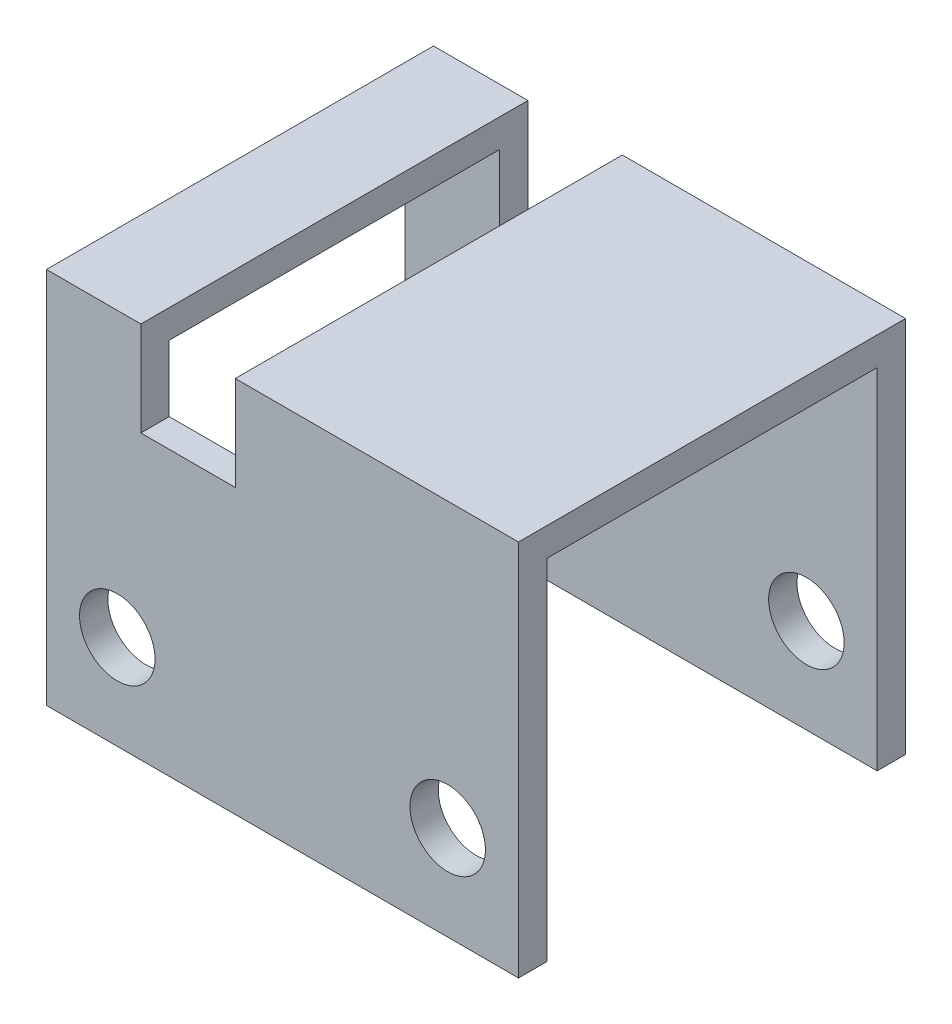
ISO-10303-21;
HEADER;
FILE_DESCRIPTION(('STEP AP214'),'2;1');
FILE_NAME('part.step','',(''),(''),'','','');
FILE_SCHEMA(('AUTOMOTIVE_DESIGN { 1 0 10303 214 1 1 1 1 }'));
ENDSEC;
DATA;
#1=APPLICATION_CONTEXT('core data for automotive mechanical design processes');
#2=APPLICATION_PROTOCOL_DEFINITION('international standard','automotive_design',2000,#1);
#3=PRODUCT_CONTEXT('',#1,'mechanical');
#4=PRODUCT('Part','Part','',(#3));
#5=PRODUCT_RELATED_PRODUCT_CATEGORY('part','',(#4));
#6=PRODUCT_DEFINITION_FORMATION('','',#4);
#7=PRODUCT_DEFINITION_CONTEXT('part definition',#1,'design');
#8=PRODUCT_DEFINITION('design','',#6,#7);
#9=PRODUCT_DEFINITION_SHAPE('','',#8);
#10=(LENGTH_UNIT() NAMED_UNIT(*) SI_UNIT(.MILLI.,.METRE.));
#11=(NAMED_UNIT(*) PLANE_ANGLE_UNIT() SI_UNIT($,.RADIAN.));
#12=(NAMED_UNIT(*) SI_UNIT($,.STERADIAN.) SOLID_ANGLE_UNIT());
#13=UNCERTAINTY_MEASURE_WITH_UNIT(LENGTH_MEASURE(1.E-05),#10,'distance_accuracy_value','');
#14=(GEOMETRIC_REPRESENTATION_CONTEXT(3) GLOBAL_UNCERTAINTY_ASSIGNED_CONTEXT((#13)) GLOBAL_UNIT_ASSIGNED_CONTEXT((#10,
#11,#12)) REPRESENTATION_CONTEXT('',''));
#15=CARTESIAN_POINT('',(0.,0.,0.));
#16=DIRECTION('',(0.,0.,1.));
#17=DIRECTION('',(1.,0.,0.));
#18=AXIS2_PLACEMENT_3D('',#15,#16,#17);
#19=CARTESIAN_POINT('',(-25.,-37.,41.));
#20=DIRECTION('',(0.,1.,0.));
#21=DIRECTION('',(0.,0.,1.));
#22=AXIS2_PLACEMENT_3D('',#19,#20,#21);
#23=PLANE('',#22);
#24=DIRECTION('',(0.,0.,-1.));
#25=VECTOR('',#24,1.);
#26=CARTESIAN_POINT('',(-25.,-37.,41.));
#27=LINE('',#26,#25);
#28=CARTESIAN_POINT('',(-25.,-37.,41.));
#29=VERTEX_POINT('',#28);
#30=CARTESIAN_POINT('',(-25.,-37.,38.));
#31=VERTEX_POINT('',#30);
#32=EDGE_CURVE('E165',#29,#31,#27,.T.);
#33=ORIENTED_EDGE('',*,*,#32,.T.);
#34=DIRECTION('',(1.,0.,0.));
#35=VECTOR('',#34,1.);
#36=CARTESIAN_POINT('',(-25.,-37.,38.));
#37=LINE('',#36,#35);
#38=CARTESIAN_POINT('',(25.,-37.,38.));
#39=VERTEX_POINT('',#38);
#40=EDGE_CURVE('E148',#31,#39,#37,.T.);
#41=ORIENTED_EDGE('',*,*,#40,.T.);
#42=DIRECTION('',(0.,0.,-1.));
#43=VECTOR('',#42,1.);
#44=CARTESIAN_POINT('',(25.,-37.,41.));
#45=LINE('',#44,#43);
#46=CARTESIAN_POINT('',(25.,-37.,41.));
#47=VERTEX_POINT('',#46);
#48=EDGE_CURVE('E177',#47,#39,#45,.T.);
#49=ORIENTED_EDGE('',*,*,#48,.F.);
#50=DIRECTION('',(1.,0.,0.));
#51=VECTOR('',#50,1.);
#52=CARTESIAN_POINT('',(-25.,-37.,41.));
#53=LINE('',#52,#51);
#54=EDGE_CURVE('E171',#29,#47,#53,.T.);
#55=ORIENTED_EDGE('',*,*,#54,.F.);
#56=EDGE_LOOP('',(#33,#41,#49,#55));
#57=FACE_BOUND('',#56,.T.);
#58=ADVANCED_FACE('F33',(#57),#23,.F.);
#59=CARTESIAN_POINT('',(-15.,-7.,41.));
#60=DIRECTION('',(0.,-1.,0.));
#61=DIRECTION('',(0.,0.,-1.));
#62=AXIS2_PLACEMENT_3D('',#59,#60,#61);
#63=PLANE('',#62);
#64=DIRECTION('',(0.,0.,-1.));
#65=VECTOR('',#64,1.);
#66=CARTESIAN_POINT('',(-5.,-7.,41.));
#67=LINE('',#66,#65);
#68=CARTESIAN_POINT('',(-5.,-7.,41.));
#69=VERTEX_POINT('',#68);
#70=CARTESIAN_POINT('',(-5.,-7.,38.));
#71=VERTEX_POINT('',#70);
#72=EDGE_CURVE('E281',#69,#71,#67,.T.);
#73=ORIENTED_EDGE('',*,*,#72,.T.);
#74=DIRECTION('',(-1.,0.,0.));
#75=VECTOR('',#74,1.);
#76=CARTESIAN_POINT('',(-15.,-7.,38.));
#77=LINE('',#76,#75);
#78=CARTESIAN_POINT('',(-15.,-7.,38.));
#79=VERTEX_POINT('',#78);
#80=EDGE_CURVE('E229',#71,#79,#77,.T.);
#81=ORIENTED_EDGE('',*,*,#80,.T.);
#82=DIRECTION('',(0.,0.,-1.));
#83=VECTOR('',#82,1.);
#84=CARTESIAN_POINT('',(-15.,-7.,41.));
#85=LINE('',#84,#83);
#86=CARTESIAN_POINT('',(-15.,-7.,41.));
#87=VERTEX_POINT('',#86);
#88=EDGE_CURVE('E277',#87,#79,#85,.T.);
#89=ORIENTED_EDGE('',*,*,#88,.F.);
#90=DIRECTION('',(-1.,0.,0.));
#91=VECTOR('',#90,1.);
#92=CARTESIAN_POINT('',(-15.,-7.,41.));
#93=LINE('',#92,#91);
#94=EDGE_CURVE('E246',#69,#87,#93,.T.);
#95=ORIENTED_EDGE('',*,*,#94,.F.);
#96=EDGE_LOOP('',(#73,#81,#89,#95));
#97=FACE_BOUND('',#96,.T.);
#98=ADVANCED_FACE('F324',(#97),#63,.F.);
#99=CARTESIAN_POINT('',(-25.,-37.,41.));
#100=DIRECTION('',(1.,0.,0.));
#101=DIRECTION('',(0.,1.,0.));
#102=AXIS2_PLACEMENT_3D('',#99,#100,#101);
#103=PLANE('',#102);
#104=DIRECTION('',(0.,0.,1.));
#105=VECTOR('',#104,1.);
#106=CARTESIAN_POINT('',(-25.,0.,38.));
#107=LINE('',#106,#105);
#108=CARTESIAN_POINT('',(-25.,0.,3.));
#109=VERTEX_POINT('',#108);
#110=CARTESIAN_POINT('',(-25.,0.,38.));
#111=VERTEX_POINT('',#110);
#112=EDGE_CURVE('E160',#109,#111,#107,.T.);
#113=ORIENTED_EDGE('',*,*,#112,.T.);
#114=DIRECTION('',(0.,-1.,0.));
#115=VECTOR('',#114,1.);
#116=CARTESIAN_POINT('',(-25.,-37.,38.));
#117=LINE('',#116,#115);
#118=EDGE_CURVE('E152',#111,#31,#117,.T.);
#119=ORIENTED_EDGE('',*,*,#118,.T.);
#120=ORIENTED_EDGE('',*,*,#32,.F.);
#121=DIRECTION('',(0.,-1.,0.));
#122=VECTOR('',#121,1.);
#123=CARTESIAN_POINT('',(-25.,-37.,41.));
#124=LINE('',#123,#122);
#125=CARTESIAN_POINT('',(-25.,3.,41.));
#126=VERTEX_POINT('',#125);
#127=EDGE_CURVE('E236',#126,#29,#124,.T.);
#128=ORIENTED_EDGE('',*,*,#127,.F.);
#129=DIRECTION('',(0.,0.,-1.));
#130=VECTOR('',#129,1.);
#131=CARTESIAN_POINT('',(-25.,3.,41.));
#132=LINE('',#131,#130);
#133=CARTESIAN_POINT('',(-25.,3.,0.));
#134=VERTEX_POINT('',#133);
#135=EDGE_CURVE('E252',#126,#134,#132,.T.);
#136=ORIENTED_EDGE('',*,*,#135,.T.);
#137=DIRECTION('',(0.,-1.,0.));
#138=VECTOR('',#137,1.);
#139=CARTESIAN_POINT('',(-25.,-37.,0.));
#140=LINE('',#139,#138);
#141=CARTESIAN_POINT('',(-25.,-37.,0.));
#142=VERTEX_POINT('',#141);
#143=EDGE_CURVE('E235',#134,#142,#140,.T.);
#144=ORIENTED_EDGE('',*,*,#143,.T.);
#145=CARTESIAN_POINT('',(-25.,-37.,3.));
#146=VERTEX_POINT('',#145);
#147=EDGE_CURVE('E174',#146,#142,#27,.T.);
#148=ORIENTED_EDGE('',*,*,#147,.F.);
#149=DIRECTION('',(0.,1.,0.));
#150=VECTOR('',#149,1.);
#151=CARTESIAN_POINT('',(-25.,-37.,3.));
#152=LINE('',#151,#150);
#153=EDGE_CURVE('E168',#146,#109,#152,.T.);
#154=ORIENTED_EDGE('',*,*,#153,.T.);
#155=EDGE_LOOP('',(#113,#119,#120,#128,#136,#144,#148,#154));
#156=FACE_BOUND('',#155,.T.);
#157=ADVANCED_FACE('F35',(#156),#103,.F.);
#158=CARTESIAN_POINT('',(25.,-37.,3.));
#159=VERTEX_POINT('',#158);
#160=CARTESIAN_POINT('',(25.,-37.,0.));
#161=VERTEX_POINT('',#160);
#162=EDGE_CURVE('E288',#159,#161,#45,.T.);
#163=ORIENTED_EDGE('',*,*,#162,.F.);
#164=DIRECTION('',(1.,0.,0.));
#165=VECTOR('',#164,1.);
#166=CARTESIAN_POINT('',(-25.,-37.,3.));
#167=LINE('',#166,#165);
#168=EDGE_CURVE('E50',#146,#159,#167,.T.);
#169=ORIENTED_EDGE('',*,*,#168,.F.);
#170=ORIENTED_EDGE('',*,*,#147,.T.);
#171=DIRECTION('',(1.,0.,0.));
#172=VECTOR('',#171,1.);
#173=CARTESIAN_POINT('',(-25.,-37.,0.));
#174=LINE('',#173,#172);
#175=EDGE_CURVE('E255',#142,#161,#174,.T.);
#176=ORIENTED_EDGE('',*,*,#175,.T.);
#177=EDGE_LOOP('',(#163,#169,#170,#176));
#178=FACE_BOUND('',#177,.T.);
#179=ADVANCED_FACE('F313',(#178),#23,.F.);
#180=CARTESIAN_POINT('',(25.,-37.,41.));
#181=DIRECTION('',(-1.,0.,0.));
#182=DIRECTION('',(0.,0.,1.));
#183=AXIS2_PLACEMENT_3D('',#180,#181,#182);
#184=PLANE('',#183);
#185=ORIENTED_EDGE('',*,*,#48,.T.);
#186=DIRECTION('',(0.,-1.,0.));
#187=VECTOR('',#186,1.);
#188=CARTESIAN_POINT('',(25.,-37.,38.));
#189=LINE('',#188,#187);
#190=CARTESIAN_POINT('',(25.,0.,38.));
#191=VERTEX_POINT('',#190);
#192=EDGE_CURVE('E155',#191,#39,#189,.T.);
#193=ORIENTED_EDGE('',*,*,#192,.F.);
#194=DIRECTION('',(0.,0.,1.));
#195=VECTOR('',#194,1.);
#196=CARTESIAN_POINT('',(25.,0.,38.));
#197=LINE('',#196,#195);
#198=CARTESIAN_POINT('',(25.,0.,3.));
#199=VERTEX_POINT('',#198);
#200=EDGE_CURVE('E169',#199,#191,#197,.T.);
#201=ORIENTED_EDGE('',*,*,#200,.F.);
#202=DIRECTION('',(0.,1.,0.));
#203=VECTOR('',#202,1.);
#204=CARTESIAN_POINT('',(25.,-37.,3.));
#205=LINE('',#204,#203);
#206=EDGE_CURVE('E210',#159,#199,#205,.T.);
#207=ORIENTED_EDGE('',*,*,#206,.F.);
#208=ORIENTED_EDGE('',*,*,#162,.T.);
#209=DIRECTION('',(0.,1.,0.));
#210=VECTOR('',#209,1.);
#211=CARTESIAN_POINT('',(25.,-37.,0.));
#212=LINE('',#211,#210);
#213=CARTESIAN_POINT('',(25.,3.,0.));
#214=VERTEX_POINT('',#213);
#215=EDGE_CURVE('E258',#161,#214,#212,.T.);
#216=ORIENTED_EDGE('',*,*,#215,.T.);
#217=DIRECTION('',(0.,0.,-1.));
#218=VECTOR('',#217,1.);
#219=CARTESIAN_POINT('',(25.,3.,41.));
#220=LINE('',#219,#218);
#221=CARTESIAN_POINT('',(25.,3.,41.));
#222=VERTEX_POINT('',#221);
#223=EDGE_CURVE('E286',#222,#214,#220,.T.);
#224=ORIENTED_EDGE('',*,*,#223,.F.);
#225=DIRECTION('',(0.,1.,0.));
#226=VECTOR('',#225,1.);
#227=CARTESIAN_POINT('',(25.,-37.,41.));
#228=LINE('',#227,#226);
#229=EDGE_CURVE('E240',#47,#222,#228,.T.);
#230=ORIENTED_EDGE('',*,*,#229,.F.);
#231=EDGE_LOOP('',(#185,#193,#201,#207,#208,#216,#224,#230));
#232=FACE_BOUND('',#231,.T.);
#233=ADVANCED_FACE('F296',(#232),#184,.F.);
#234=CARTESIAN_POINT('',(-5.,3.,41.));
#235=DIRECTION('',(0.,-1.,0.));
#236=DIRECTION('',(0.,0.,-1.));
#237=AXIS2_PLACEMENT_3D('',#234,#235,#236);
#238=PLANE('',#237);
#239=DIRECTION('',(-1.,0.,0.));
#240=VECTOR('',#239,1.);
#241=CARTESIAN_POINT('',(-5.,3.,0.));
#242=LINE('',#241,#240);
#243=CARTESIAN_POINT('',(-5.,3.,0.));
#244=VERTEX_POINT('',#243);
#245=EDGE_CURVE('E260',#214,#244,#242,.T.);
#246=ORIENTED_EDGE('',*,*,#245,.T.);
#247=DIRECTION('',(0.,0.,-1.));
#248=VECTOR('',#247,1.);
#249=CARTESIAN_POINT('',(-5.,3.,41.));
#250=LINE('',#249,#248);
#251=CARTESIAN_POINT('',(-5.,3.,41.));
#252=VERTEX_POINT('',#251);
#253=EDGE_CURVE('E284',#252,#244,#250,.T.);
#254=ORIENTED_EDGE('',*,*,#253,.F.);
#255=DIRECTION('',(-1.,0.,0.));
#256=VECTOR('',#255,1.);
#257=CARTESIAN_POINT('',(-5.,3.,41.));
#258=LINE('',#257,#256);
#259=EDGE_CURVE('E242',#222,#252,#258,.T.);
#260=ORIENTED_EDGE('',*,*,#259,.F.);
#261=ORIENTED_EDGE('',*,*,#223,.T.);
#262=EDGE_LOOP('',(#246,#254,#260,#261));
#263=FACE_BOUND('',#262,.T.);
#264=ADVANCED_FACE('F361',(#263),#238,.F.);
#265=CARTESIAN_POINT('',(-5.,-7.,41.));
#266=DIRECTION('',(1.,0.,0.));
#267=DIRECTION('',(0.,0.,-1.));
#268=AXIS2_PLACEMENT_3D('',#265,#266,#267);
#269=PLANE('',#268);
#270=DIRECTION('',(0.,0.,1.));
#271=VECTOR('',#270,1.);
#272=CARTESIAN_POINT('',(-5.,0.,41.));
#273=LINE('',#272,#271);
#274=CARTESIAN_POINT('',(-5.,0.,3.));
#275=VERTEX_POINT('',#274);
#276=CARTESIAN_POINT('',(-5.,0.,38.));
#277=VERTEX_POINT('',#276);
#278=EDGE_CURVE('E226',#275,#277,#273,.T.);
#279=ORIENTED_EDGE('',*,*,#278,.T.);
#280=DIRECTION('',(0.,-1.,0.));
#281=VECTOR('',#280,1.);
#282=CARTESIAN_POINT('',(-5.,-7.,38.));
#283=LINE('',#282,#281);
#284=EDGE_CURVE('E232',#277,#71,#283,.T.);
#285=ORIENTED_EDGE('',*,*,#284,.T.);
#286=ORIENTED_EDGE('',*,*,#72,.F.);
#287=DIRECTION('',(0.,-1.,0.));
#288=VECTOR('',#287,1.);
#289=CARTESIAN_POINT('',(-5.,-7.,41.));
#290=LINE('',#289,#288);
#291=EDGE_CURVE('E244',#252,#69,#290,.T.);
#292=ORIENTED_EDGE('',*,*,#291,.F.);
#293=ORIENTED_EDGE('',*,*,#253,.T.);
#294=DIRECTION('',(0.,-1.,0.));
#295=VECTOR('',#294,1.);
#296=CARTESIAN_POINT('',(-5.,-7.,0.));
#297=LINE('',#296,#295);
#298=CARTESIAN_POINT('',(-5.,-7.,0.));
#299=VERTEX_POINT('',#298);
#300=EDGE_CURVE('E262',#244,#299,#297,.T.);
#301=ORIENTED_EDGE('',*,*,#300,.T.);
#302=CARTESIAN_POINT('',(-5.,-7.,3.));
#303=VERTEX_POINT('',#302);
#304=EDGE_CURVE('E280',#303,#299,#67,.T.);
#305=ORIENTED_EDGE('',*,*,#304,.F.);
#306=DIRECTION('',(0.,1.,0.));
#307=VECTOR('',#306,1.);
#308=CARTESIAN_POINT('',(-5.,-6.99999999999999,3.));
#309=LINE('',#308,#307);
#310=EDGE_CURVE('E223',#303,#275,#309,.T.);
#311=ORIENTED_EDGE('',*,*,#310,.T.);
#312=EDGE_LOOP('',(#279,#285,#286,#292,#293,#301,#305,#311));
#313=FACE_BOUND('',#312,.T.);
#314=ADVANCED_FACE('F328',(#313),#269,.F.);
#315=CARTESIAN_POINT('',(-15.,-7.,3.));
#316=VERTEX_POINT('',#315);
#317=CARTESIAN_POINT('',(-15.,-7.,0.));
#318=VERTEX_POINT('',#317);
#319=EDGE_CURVE('E276',#316,#318,#85,.T.);
#320=ORIENTED_EDGE('',*,*,#319,.F.);
#321=DIRECTION('',(1.,0.,0.));
#322=VECTOR('',#321,1.);
#323=CARTESIAN_POINT('',(-15.,-7.,3.));
#324=LINE('',#323,#322);
#325=EDGE_CURVE('E57',#316,#303,#324,.T.);
#326=ORIENTED_EDGE('',*,*,#325,.T.);
#327=ORIENTED_EDGE('',*,*,#304,.T.);
#328=DIRECTION('',(-1.,0.,0.));
#329=VECTOR('',#328,1.);
#330=CARTESIAN_POINT('',(-15.,-7.,0.));
#331=LINE('',#330,#329);
#332=EDGE_CURVE('E265',#299,#318,#331,.T.);
#333=ORIENTED_EDGE('',*,*,#332,.T.);
#334=EDGE_LOOP('',(#320,#326,#327,#333));
#335=FACE_BOUND('',#334,.T.);
#336=ADVANCED_FACE('F336',(#335),#63,.F.);
#337=CARTESIAN_POINT('',(-15.,3.,41.));
#338=DIRECTION('',(-1.,0.,0.));
#339=DIRECTION('',(0.,-1.,0.));
#340=AXIS2_PLACEMENT_3D('',#337,#338,#339);
#341=PLANE('',#340);
#342=ORIENTED_EDGE('',*,*,#88,.T.);
#343=DIRECTION('',(0.,1.,0.));
#344=VECTOR('',#343,1.);
#345=CARTESIAN_POINT('',(-15.,3.,38.));
#346=LINE('',#345,#344);
#347=CARTESIAN_POINT('',(-15.,0.,38.));
#348=VERTEX_POINT('',#347);
#349=EDGE_CURVE('E11',#79,#348,#346,.T.);
#350=ORIENTED_EDGE('',*,*,#349,.T.);
#351=DIRECTION('',(0.,0.,-1.));
#352=VECTOR('',#351,1.);
#353=CARTESIAN_POINT('',(-15.,0.,41.));
#354=LINE('',#353,#352);
#355=CARTESIAN_POINT('',(-15.,0.,3.));
#356=VERTEX_POINT('',#355);
#357=EDGE_CURVE('E42',#348,#356,#354,.T.);
#358=ORIENTED_EDGE('',*,*,#357,.T.);
#359=DIRECTION('',(0.,-1.,0.));
#360=VECTOR('',#359,1.);
#361=CARTESIAN_POINT('',(-15.,3.00000000000001,3.));
#362=LINE('',#361,#360);
#363=EDGE_CURVE('E173',#356,#316,#362,.T.);
#364=ORIENTED_EDGE('',*,*,#363,.T.);
#365=ORIENTED_EDGE('',*,*,#319,.T.);
#366=DIRECTION('',(0.,1.,0.));
#367=VECTOR('',#366,1.);
#368=CARTESIAN_POINT('',(-15.,3.,0.));
#369=LINE('',#368,#367);
#370=CARTESIAN_POINT('',(-15.,3.,0.));
#371=VERTEX_POINT('',#370);
#372=EDGE_CURVE('E268',#318,#371,#369,.T.);
#373=ORIENTED_EDGE('',*,*,#372,.T.);
#374=DIRECTION('',(0.,0.,-1.));
#375=VECTOR('',#374,1.);
#376=CARTESIAN_POINT('',(-15.,3.,41.));
#377=LINE('',#376,#375);
#378=CARTESIAN_POINT('',(-15.,3.,41.));
#379=VERTEX_POINT('',#378);
#380=EDGE_CURVE('E273',#379,#371,#377,.T.);
#381=ORIENTED_EDGE('',*,*,#380,.F.);
#382=DIRECTION('',(0.,1.,0.));
#383=VECTOR('',#382,1.);
#384=CARTESIAN_POINT('',(-15.,3.,41.));
#385=LINE('',#384,#383);
#386=EDGE_CURVE('E248',#87,#379,#385,.T.);
#387=ORIENTED_EDGE('',*,*,#386,.F.);
#388=EDGE_LOOP('',(#342,#350,#358,#364,#365,#373,#381,#387));
#389=FACE_BOUND('',#388,.T.);
#390=ADVANCED_FACE('F318',(#389),#341,.F.);
#391=CARTESIAN_POINT('',(-25.,3.,41.));
#392=DIRECTION('',(0.,-1.,0.));
#393=DIRECTION('',(0.,0.,-1.));
#394=AXIS2_PLACEMENT_3D('',#391,#392,#393);
#395=PLANE('',#394);
#396=DIRECTION('',(-1.,0.,0.));
#397=VECTOR('',#396,1.);
#398=CARTESIAN_POINT('',(-25.,3.,0.));
#399=LINE('',#398,#397);
#400=EDGE_CURVE('E238',#371,#134,#399,.T.);
#401=ORIENTED_EDGE('',*,*,#400,.T.);
#402=ORIENTED_EDGE('',*,*,#135,.F.);
#403=DIRECTION('',(-1.,0.,0.));
#404=VECTOR('',#403,1.);
#405=CARTESIAN_POINT('',(-25.,3.,41.));
#406=LINE('',#405,#404);
#407=EDGE_CURVE('E250',#379,#126,#406,.T.);
#408=ORIENTED_EDGE('',*,*,#407,.F.);
#409=ORIENTED_EDGE('',*,*,#380,.T.);
#410=EDGE_LOOP('',(#401,#402,#408,#409));
#411=FACE_BOUND('',#410,.T.);
#412=ADVANCED_FACE('F339',(#411),#395,.F.);
#413=CARTESIAN_POINT('',(0.,0.,41.));
#414=DIRECTION('',(0.,0.,-1.));
#415=DIRECTION('',(-1.,0.,0.));
#416=AXIS2_PLACEMENT_3D('',#413,#414,#415);
#417=PLANE('',#416);
#418=CARTESIAN_POINT('',(-17.5,-27.,41.));
#419=DIRECTION('',(0.,0.,1.));
#420=DIRECTION('',(1.,0.,0.));
#421=AXIS2_PLACEMENT_3D('',#418,#419,#420);
#422=CIRCLE('',#421,4.);
#423=CARTESIAN_POINT('',(-13.5,-27.,41.));
#424=VERTEX_POINT('',#423);
#425=EDGE_CURVE('E191',#424,#424,#422,.T.);
#426=ORIENTED_EDGE('',*,*,#425,.F.);
#427=EDGE_LOOP('',(#426));
#428=FACE_BOUND('',#427,.T.);
#429=CARTESIAN_POINT('',(17.5,-27.,41.));
#430=DIRECTION('',(0.,0.,1.));
#431=DIRECTION('',(1.,0.,0.));
#432=AXIS2_PLACEMENT_3D('',#429,#430,#431);
#433=CIRCLE('',#432,4.);
#434=CARTESIAN_POINT('',(21.5,-27.,41.));
#435=VERTEX_POINT('',#434);
#436=EDGE_CURVE('E201',#435,#435,#433,.T.);
#437=ORIENTED_EDGE('',*,*,#436,.F.);
#438=EDGE_LOOP('',(#437));
#439=FACE_BOUND('',#438,.T.);
#440=ORIENTED_EDGE('',*,*,#127,.T.);
#441=ORIENTED_EDGE('',*,*,#54,.T.);
#442=ORIENTED_EDGE('',*,*,#229,.T.);
#443=ORIENTED_EDGE('',*,*,#259,.T.);
#444=ORIENTED_EDGE('',*,*,#291,.T.);
#445=ORIENTED_EDGE('',*,*,#94,.T.);
#446=ORIENTED_EDGE('',*,*,#386,.T.);
#447=ORIENTED_EDGE('',*,*,#407,.T.);
#448=EDGE_LOOP('',(#440,#441,#442,#443,#444,#445,#446,#447));
#449=FACE_BOUND('',#448,.T.);
#450=ADVANCED_FACE('F299',(#428,#439,#449),#417,.F.);
#451=CARTESIAN_POINT('',(0.,0.,0.));
#452=DIRECTION('',(0.,0.,-1.));
#453=DIRECTION('',(-1.,0.,0.));
#454=AXIS2_PLACEMENT_3D('',#451,#452,#453);
#455=PLANE('',#454);
#456=CARTESIAN_POINT('',(-17.5,-27.,0.));
#457=DIRECTION('',(0.,0.,1.));
#458=DIRECTION('',(1.,0.,0.));
#459=AXIS2_PLACEMENT_3D('',#456,#457,#458);
#460=CIRCLE('',#459,4.);
#461=CARTESIAN_POINT('',(-13.5,-27.,0.));
#462=VERTEX_POINT('',#461);
#463=EDGE_CURVE('E185',#462,#462,#460,.T.);
#464=ORIENTED_EDGE('',*,*,#463,.T.);
#465=EDGE_LOOP('',(#464));
#466=FACE_BOUND('',#465,.T.);
#467=CARTESIAN_POINT('',(17.5,-27.,0.));
#468=DIRECTION('',(0.,0.,1.));
#469=DIRECTION('',(1.,0.,0.));
#470=AXIS2_PLACEMENT_3D('',#467,#468,#469);
#471=CIRCLE('',#470,4.);
#472=CARTESIAN_POINT('',(21.5,-27.,0.));
#473=VERTEX_POINT('',#472);
#474=EDGE_CURVE('E196',#473,#473,#471,.T.);
#475=ORIENTED_EDGE('',*,*,#474,.T.);
#476=EDGE_LOOP('',(#475));
#477=FACE_BOUND('',#476,.T.);
#478=ORIENTED_EDGE('',*,*,#143,.F.);
#479=ORIENTED_EDGE('',*,*,#400,.F.);
#480=ORIENTED_EDGE('',*,*,#372,.F.);
#481=ORIENTED_EDGE('',*,*,#332,.F.);
#482=ORIENTED_EDGE('',*,*,#300,.F.);
#483=ORIENTED_EDGE('',*,*,#245,.F.);
#484=ORIENTED_EDGE('',*,*,#215,.F.);
#485=ORIENTED_EDGE('',*,*,#175,.F.);
#486=EDGE_LOOP('',(#478,#479,#480,#481,#482,#483,#484,#485));
#487=FACE_BOUND('',#486,.T.);
#488=ADVANCED_FACE('F309',(#466,#477,#487),#455,.T.);
#489=CARTESIAN_POINT('',(-25.,-37.,38.));
#490=DIRECTION('',(0.,0.,1.));
#491=DIRECTION('',(1.,0.,0.));
#492=AXIS2_PLACEMENT_3D('',#489,#490,#491);
#493=PLANE('',#492);
#494=CARTESIAN_POINT('',(-17.5,-27.,38.));
#495=DIRECTION('',(0.,0.,1.));
#496=DIRECTION('',(1.,0.,0.));
#497=AXIS2_PLACEMENT_3D('',#494,#495,#496);
#498=CIRCLE('',#497,4.);
#499=CARTESIAN_POINT('',(-13.5,-27.,38.));
#500=VERTEX_POINT('',#499);
#501=EDGE_CURVE('E204',#500,#500,#498,.T.);
#502=ORIENTED_EDGE('',*,*,#501,.T.);
#503=EDGE_LOOP('',(#502));
#504=FACE_BOUND('',#503,.T.);
#505=CARTESIAN_POINT('',(17.5,-27.,38.));
#506=DIRECTION('',(0.,0.,1.));
#507=DIRECTION('',(1.,0.,0.));
#508=AXIS2_PLACEMENT_3D('',#505,#506,#507);
#509=CIRCLE('',#508,4.);
#510=CARTESIAN_POINT('',(21.5,-27.,38.));
#511=VERTEX_POINT('',#510);
#512=EDGE_CURVE('E184',#511,#511,#509,.T.);
#513=ORIENTED_EDGE('',*,*,#512,.T.);
#514=EDGE_LOOP('',(#513));
#515=FACE_BOUND('',#514,.T.);
#516=DIRECTION('',(1.,0.,0.));
#517=VECTOR('',#516,1.);
#518=CARTESIAN_POINT('',(-25.,0.,38.));
#519=LINE('',#518,#517);
#520=EDGE_CURVE('E216',#277,#191,#519,.T.);
#521=ORIENTED_EDGE('',*,*,#520,.T.);
#522=ORIENTED_EDGE('',*,*,#192,.T.);
#523=ORIENTED_EDGE('',*,*,#40,.F.);
#524=ORIENTED_EDGE('',*,*,#118,.F.);
#525=EDGE_CURVE('E214',#111,#348,#519,.T.);
#526=ORIENTED_EDGE('',*,*,#525,.T.);
#527=ORIENTED_EDGE('',*,*,#349,.F.);
#528=ORIENTED_EDGE('',*,*,#80,.F.);
#529=ORIENTED_EDGE('',*,*,#284,.F.);
#530=EDGE_LOOP('',(#521,#522,#523,#524,#526,#527,#528,#529));
#531=FACE_BOUND('',#530,.T.);
#532=ADVANCED_FACE('F150',(#504,#515,#531),#493,.F.);
#533=CARTESIAN_POINT('',(-25.,0.,38.));
#534=DIRECTION('',(0.,1.,0.));
#535=DIRECTION('',(0.,0.,1.));
#536=AXIS2_PLACEMENT_3D('',#533,#534,#535);
#537=PLANE('',#536);
#538=DIRECTION('',(1.,0.,0.));
#539=VECTOR('',#538,1.);
#540=CARTESIAN_POINT('',(-25.,0.,3.));
#541=LINE('',#540,#539);
#542=EDGE_CURVE('E220',#275,#199,#541,.T.);
#543=ORIENTED_EDGE('',*,*,#542,.T.);
#544=ORIENTED_EDGE('',*,*,#200,.T.);
#545=ORIENTED_EDGE('',*,*,#520,.F.);
#546=ORIENTED_EDGE('',*,*,#278,.F.);
#547=EDGE_LOOP('',(#543,#544,#545,#546));
#548=FACE_BOUND('',#547,.T.);
#549=ADVANCED_FACE('F333',(#548),#537,.F.);
#550=ORIENTED_EDGE('',*,*,#525,.F.);
#551=ORIENTED_EDGE('',*,*,#112,.F.);
#552=EDGE_CURVE('E217',#109,#356,#541,.T.);
#553=ORIENTED_EDGE('',*,*,#552,.T.);
#554=ORIENTED_EDGE('',*,*,#357,.F.);
#555=EDGE_LOOP('',(#550,#551,#553,#554));
#556=FACE_BOUND('',#555,.T.);
#557=ADVANCED_FACE('F316',(#556),#537,.F.);
#558=CARTESIAN_POINT('',(-25.,-37.,3.));
#559=DIRECTION('',(0.,0.,-1.));
#560=DIRECTION('',(0.,1.,0.));
#561=AXIS2_PLACEMENT_3D('',#558,#559,#560);
#562=PLANE('',#561);
#563=CARTESIAN_POINT('',(-17.5,-27.,3.));
#564=DIRECTION('',(0.,0.,-1.));
#565=DIRECTION('',(0.,1.,0.));
#566=AXIS2_PLACEMENT_3D('',#563,#564,#565);
#567=CIRCLE('',#566,4.);
#568=CARTESIAN_POINT('',(-17.5,-23.,3.));
#569=VERTEX_POINT('',#568);
#570=EDGE_CURVE('E37',#569,#569,#567,.T.);
#571=ORIENTED_EDGE('',*,*,#570,.T.);
#572=EDGE_LOOP('',(#571));
#573=FACE_BOUND('',#572,.T.);
#574=CARTESIAN_POINT('',(17.5,-27.,3.));
#575=DIRECTION('',(0.,0.,-1.));
#576=DIRECTION('',(0.,1.,0.));
#577=AXIS2_PLACEMENT_3D('',#574,#575,#576);
#578=CIRCLE('',#577,4.);
#579=CARTESIAN_POINT('',(17.5,-23.,3.));
#580=VERTEX_POINT('',#579);
#581=EDGE_CURVE('E182',#580,#580,#578,.T.);
#582=ORIENTED_EDGE('',*,*,#581,.T.);
#583=EDGE_LOOP('',(#582));
#584=FACE_BOUND('',#583,.T.);
#585=ORIENTED_EDGE('',*,*,#325,.F.);
#586=ORIENTED_EDGE('',*,*,#363,.F.);
#587=ORIENTED_EDGE('',*,*,#552,.F.);
#588=ORIENTED_EDGE('',*,*,#153,.F.);
#589=ORIENTED_EDGE('',*,*,#168,.T.);
#590=ORIENTED_EDGE('',*,*,#206,.T.);
#591=ORIENTED_EDGE('',*,*,#542,.F.);
#592=ORIENTED_EDGE('',*,*,#310,.F.);
#593=EDGE_LOOP('',(#585,#586,#587,#588,#589,#590,#591,#592));
#594=FACE_BOUND('',#593,.T.);
#595=ADVANCED_FACE('F314',(#573,#584,#594),#562,.F.);
#596=CARTESIAN_POINT('',(17.5,-27.,0.));
#597=DIRECTION('',(0.,0.,1.));
#598=DIRECTION('',(1.,0.,0.));
#599=AXIS2_PLACEMENT_3D('',#596,#597,#598);
#600=CYLINDRICAL_SURFACE('',#599,4.);
#601=ORIENTED_EDGE('',*,*,#474,.F.);
#602=EDGE_LOOP('',(#601));
#603=FACE_BOUND('',#602,.T.);
#604=ORIENTED_EDGE('',*,*,#581,.F.);
#605=EDGE_LOOP('',(#604));
#606=FACE_BOUND('',#605,.T.);
#607=ADVANCED_FACE('F450',(#603,#606),#600,.F.);
#608=CARTESIAN_POINT('',(-17.5,-27.,0.));
#609=DIRECTION('',(0.,0.,1.));
#610=DIRECTION('',(1.,0.,0.));
#611=AXIS2_PLACEMENT_3D('',#608,#609,#610);
#612=CYLINDRICAL_SURFACE('',#611,4.);
#613=ORIENTED_EDGE('',*,*,#463,.F.);
#614=EDGE_LOOP('',(#613));
#615=FACE_BOUND('',#614,.T.);
#616=ORIENTED_EDGE('',*,*,#570,.F.);
#617=EDGE_LOOP('',(#616));
#618=FACE_BOUND('',#617,.T.);
#619=ADVANCED_FACE('F460',(#615,#618),#612,.F.);
#620=ORIENTED_EDGE('',*,*,#436,.T.);
#621=EDGE_LOOP('',(#620));
#622=FACE_BOUND('',#621,.T.);
#623=ORIENTED_EDGE('',*,*,#512,.F.);
#624=EDGE_LOOP('',(#623));
#625=FACE_BOUND('',#624,.T.);
#626=ADVANCED_FACE('F463',(#622,#625),#600,.F.);
#627=ORIENTED_EDGE('',*,*,#425,.T.);
#628=EDGE_LOOP('',(#627));
#629=FACE_BOUND('',#628,.T.);
#630=ORIENTED_EDGE('',*,*,#501,.F.);
#631=EDGE_LOOP('',(#630));
#632=FACE_BOUND('',#631,.T.);
#633=ADVANCED_FACE('F473',(#629,#632),#612,.F.);
#634=CLOSED_SHELL('',(#58,#98,#157,#179,#233,#264,#314,#336,#390,#412,#450,#488,#532,#549,#557,
#595,#607,#619,#626,#633));
#635=MANIFOLD_SOLID_BREP('B2',#634);
#636=ADVANCED_BREP_SHAPE_REPRESENTATION('',(#18,#635),#14);
#637=SHAPE_DEFINITION_REPRESENTATION(#9,#636);
ENDSEC;
END-ISO-10303-21;
